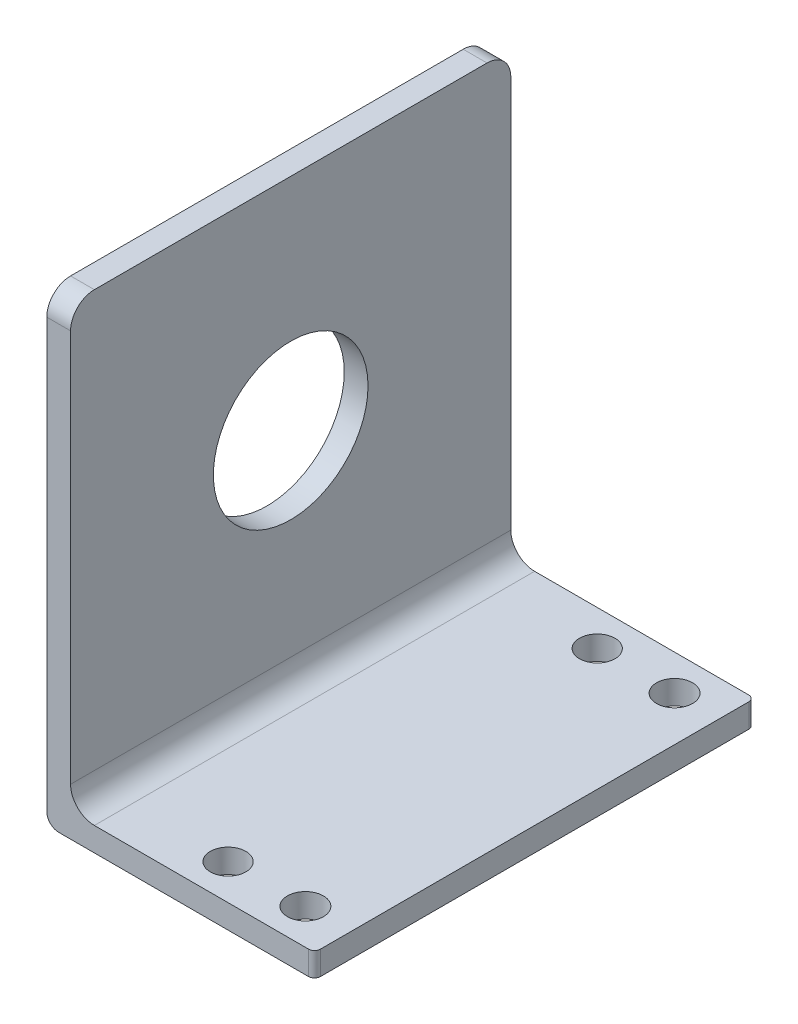
ISO-10303-21;
HEADER;
FILE_DESCRIPTION(('STEP AP214'),'2;1');
FILE_NAME('part.step','',(''),(''),'','','');
FILE_SCHEMA(('AUTOMOTIVE_DESIGN { 1 0 10303 214 1 1 1 1 }'));
ENDSEC;
DATA;
#1=APPLICATION_CONTEXT('core data for automotive mechanical design processes');
#2=APPLICATION_PROTOCOL_DEFINITION('international standard','automotive_design',2000,#1);
#3=PRODUCT_CONTEXT('',#1,'mechanical');
#4=PRODUCT('Part','Part','',(#3));
#5=PRODUCT_RELATED_PRODUCT_CATEGORY('part','',(#4));
#6=PRODUCT_DEFINITION_FORMATION('','',#4);
#7=PRODUCT_DEFINITION_CONTEXT('part definition',#1,'design');
#8=PRODUCT_DEFINITION('design','',#6,#7);
#9=PRODUCT_DEFINITION_SHAPE('','',#8);
#10=(LENGTH_UNIT() NAMED_UNIT(*) SI_UNIT(.MILLI.,.METRE.));
#11=(NAMED_UNIT(*) PLANE_ANGLE_UNIT() SI_UNIT($,.RADIAN.));
#12=(NAMED_UNIT(*) SI_UNIT($,.STERADIAN.) SOLID_ANGLE_UNIT());
#13=UNCERTAINTY_MEASURE_WITH_UNIT(LENGTH_MEASURE(1.E-05),#10,'distance_accuracy_value','');
#14=(GEOMETRIC_REPRESENTATION_CONTEXT(3) GLOBAL_UNCERTAINTY_ASSIGNED_CONTEXT((#13)) GLOBAL_UNIT_ASSIGNED_CONTEXT((#10,
#11,#12)) REPRESENTATION_CONTEXT('',''));
#15=CARTESIAN_POINT('',(0.,0.,0.));
#16=DIRECTION('',(0.,0.,1.));
#17=DIRECTION('',(1.,0.,0.));
#18=AXIS2_PLACEMENT_3D('',#15,#16,#17);
#19=CARTESIAN_POINT('',(20.5,0.,37.));
#20=DIRECTION('',(0.,-1.,0.));
#21=DIRECTION('',(0.,0.,-1.));
#22=AXIS2_PLACEMENT_3D('',#19,#20,#21);
#23=PLANE('',#22);
#24=DIRECTION('',(-1.,0.,0.));
#25=VECTOR('',#24,1.);
#26=CARTESIAN_POINT('',(20.5,0.,0.));
#27=LINE('',#26,#25);
#28=CARTESIAN_POINT('',(20.,0.,0.));
#29=VERTEX_POINT('',#28);
#30=CARTESIAN_POINT('',(2.00000000000001,0.,0.));
#31=VERTEX_POINT('',#30);
#32=EDGE_CURVE('E161',#29,#31,#27,.T.);
#33=ORIENTED_EDGE('',*,*,#32,.T.);
#34=DIRECTION('',(0.,0.,-1.));
#35=VECTOR('',#34,1.);
#36=CARTESIAN_POINT('',(2.,0.,37.));
#37=LINE('',#36,#35);
#38=CARTESIAN_POINT('',(2.00000000000001,0.,37.));
#39=VERTEX_POINT('',#38);
#40=EDGE_CURVE('E61',#31,#39,#37,.F.);
#41=ORIENTED_EDGE('',*,*,#40,.T.);
#42=DIRECTION('',(-1.,0.,0.));
#43=VECTOR('',#42,1.);
#44=CARTESIAN_POINT('',(20.5,0.,37.));
#45=LINE('',#44,#43);
#46=CARTESIAN_POINT('',(20.,0.,37.));
#47=VERTEX_POINT('',#46);
#48=EDGE_CURVE('E173',#47,#39,#45,.T.);
#49=ORIENTED_EDGE('',*,*,#48,.F.);
#50=CARTESIAN_POINT('',(20.,0.,36.5));
#51=DIRECTION('',(0.,-1.,0.));
#52=DIRECTION('',(0.,0.,-1.));
#53=AXIS2_PLACEMENT_3D('',#50,#51,#52);
#54=CIRCLE('',#53,0.5);
#55=CARTESIAN_POINT('',(20.5,0.,36.5));
#56=VERTEX_POINT('',#55);
#57=EDGE_CURVE('E228',#47,#56,#54,.F.);
#58=ORIENTED_EDGE('',*,*,#57,.T.);
#59=DIRECTION('',(0.,0.,-1.));
#60=VECTOR('',#59,1.);
#61=CARTESIAN_POINT('',(20.5,0.,37.));
#62=LINE('',#61,#60);
#63=CARTESIAN_POINT('',(20.5,0.,0.5));
#64=VERTEX_POINT('',#63);
#65=EDGE_CURVE('E157',#56,#64,#62,.T.);
#66=ORIENTED_EDGE('',*,*,#65,.T.);
#67=CARTESIAN_POINT('',(20.,0.,0.5));
#68=DIRECTION('',(0.,-1.,0.));
#69=DIRECTION('',(0.,0.,-1.));
#70=AXIS2_PLACEMENT_3D('',#67,#68,#69);
#71=CIRCLE('',#70,0.5);
#72=EDGE_CURVE('E226',#64,#29,#71,.F.);
#73=ORIENTED_EDGE('',*,*,#72,.T.);
#74=EDGE_LOOP('',(#33,#41,#49,#58,#66,#73));
#75=FACE_BOUND('',#74,.T.);
#76=CARTESIAN_POINT('',(16.75,0.,2.98702889408689));
#77=DIRECTION('',(0.,1.,0.));
#78=DIRECTION('',(0.,0.,1.));
#79=AXIS2_PLACEMENT_3D('',#76,#77,#78);
#80=CIRCLE('',#79,1.51380108054096);
#81=CARTESIAN_POINT('',(16.75,0.,4.50082997462785));
#82=VERTEX_POINT('',#81);
#83=EDGE_CURVE('E192',#82,#82,#80,.T.);
#84=ORIENTED_EDGE('',*,*,#83,.F.);
#85=EDGE_LOOP('',(#84));
#86=FACE_BOUND('',#85,.T.);
#87=CARTESIAN_POINT('',(10.25,0.,2.98702889408689));
#88=DIRECTION('',(0.,1.,0.));
#89=DIRECTION('',(0.,0.,1.));
#90=AXIS2_PLACEMENT_3D('',#87,#88,#89);
#91=CIRCLE('',#90,1.49522613069043);
#92=CARTESIAN_POINT('',(10.25,0.,4.48225502477732));
#93=VERTEX_POINT('',#92);
#94=EDGE_CURVE('E193',#93,#93,#91,.T.);
#95=ORIENTED_EDGE('',*,*,#94,.F.);
#96=EDGE_LOOP('',(#95));
#97=FACE_BOUND('',#96,.T.);
#98=CARTESIAN_POINT('',(16.75,0.,34.0129711059131));
#99=DIRECTION('',(0.,1.,0.));
#100=DIRECTION('',(0.,0.,-1.));
#101=AXIS2_PLACEMENT_3D('',#98,#99,#100);
#102=CIRCLE('',#101,1.51380108054096);
#103=CARTESIAN_POINT('',(16.75,0.,32.4991700253722));
#104=VERTEX_POINT('',#103);
#105=EDGE_CURVE('E199',#104,#104,#102,.T.);
#106=ORIENTED_EDGE('',*,*,#105,.F.);
#107=EDGE_LOOP('',(#106));
#108=FACE_BOUND('',#107,.T.);
#109=CARTESIAN_POINT('',(10.25,0.,34.0129711059131));
#110=DIRECTION('',(0.,1.,0.));
#111=DIRECTION('',(0.,0.,-1.));
#112=AXIS2_PLACEMENT_3D('',#109,#110,#111);
#113=CIRCLE('',#112,1.49522613069043);
#114=CARTESIAN_POINT('',(10.25,0.,32.5177449752227));
#115=VERTEX_POINT('',#114);
#116=EDGE_CURVE('E203',#115,#115,#113,.T.);
#117=ORIENTED_EDGE('',*,*,#116,.F.);
#118=EDGE_LOOP('',(#117));
#119=FACE_BOUND('',#118,.T.);
#120=ADVANCED_FACE('F43',(#75,#86,#97,#108,#119),#23,.F.);
#121=CARTESIAN_POINT('',(0.,0.,37.));
#122=DIRECTION('',(-1.,0.,0.));
#123=DIRECTION('',(0.,0.,1.));
#124=AXIS2_PLACEMENT_3D('',#121,#122,#123);
#125=PLANE('',#124);
#126=CARTESIAN_POINT('',(0.,18.5,18.5));
#127=DIRECTION('',(1.,0.,0.));
#128=DIRECTION('',(0.,0.,-1.));
#129=AXIS2_PLACEMENT_3D('',#126,#127,#128);
#130=CIRCLE('',#129,6.5);
#131=CARTESIAN_POINT('',(0.,18.5,12.));
#132=VERTEX_POINT('',#131);
#133=EDGE_CURVE('E190',#132,#132,#130,.T.);
#134=ORIENTED_EDGE('',*,*,#133,.F.);
#135=EDGE_LOOP('',(#134));
#136=FACE_BOUND('',#135,.T.);
#137=DIRECTION('',(0.,1.,0.));
#138=VECTOR('',#137,1.);
#139=CARTESIAN_POINT('',(0.,0.,37.));
#140=LINE('',#139,#138);
#141=CARTESIAN_POINT('',(0.,2.,37.));
#142=VERTEX_POINT('',#141);
#143=CARTESIAN_POINT('',(0.,35.,37.));
#144=VERTEX_POINT('',#143);
#145=EDGE_CURVE('E142',#142,#144,#140,.T.);
#146=ORIENTED_EDGE('',*,*,#145,.F.);
#147=DIRECTION('',(0.,0.,-1.));
#148=VECTOR('',#147,1.);
#149=CARTESIAN_POINT('',(0.,2.,0.));
#150=LINE('',#149,#148);
#151=CARTESIAN_POINT('',(0.,2.,0.));
#152=VERTEX_POINT('',#151);
#153=EDGE_CURVE('E241',#142,#152,#150,.T.);
#154=ORIENTED_EDGE('',*,*,#153,.T.);
#155=DIRECTION('',(0.,1.,0.));
#156=VECTOR('',#155,1.);
#157=CARTESIAN_POINT('',(0.,0.,0.));
#158=LINE('',#157,#156);
#159=CARTESIAN_POINT('',(0.,35.,0.));
#160=VERTEX_POINT('',#159);
#161=EDGE_CURVE('E164',#152,#160,#158,.T.);
#162=ORIENTED_EDGE('',*,*,#161,.T.);
#163=CARTESIAN_POINT('',(0.,35.,2.));
#164=DIRECTION('',(-1.,0.,0.));
#165=DIRECTION('',(0.,0.,1.));
#166=AXIS2_PLACEMENT_3D('',#163,#164,#165);
#167=CIRCLE('',#166,2.);
#168=CARTESIAN_POINT('',(0.,37.,2.));
#169=VERTEX_POINT('',#168);
#170=EDGE_CURVE('E209',#160,#169,#167,.F.);
#171=ORIENTED_EDGE('',*,*,#170,.T.);
#172=DIRECTION('',(0.,0.,-1.));
#173=VECTOR('',#172,1.);
#174=CARTESIAN_POINT('',(0.,37.,37.));
#175=LINE('',#174,#173);
#176=CARTESIAN_POINT('',(0.,37.,35.));
#177=VERTEX_POINT('',#176);
#178=EDGE_CURVE('E181',#177,#169,#175,.T.);
#179=ORIENTED_EDGE('',*,*,#178,.F.);
#180=CARTESIAN_POINT('',(0.,35.,35.));
#181=DIRECTION('',(-1.,0.,0.));
#182=DIRECTION('',(0.,0.,1.));
#183=AXIS2_PLACEMENT_3D('',#180,#181,#182);
#184=CIRCLE('',#183,2.);
#185=EDGE_CURVE('E207',#177,#144,#184,.F.);
#186=ORIENTED_EDGE('',*,*,#185,.T.);
#187=EDGE_LOOP('',(#146,#154,#162,#171,#179,#186));
#188=FACE_BOUND('',#187,.T.);
#189=ADVANCED_FACE('F250',(#136,#188),#125,.F.);
#190=CARTESIAN_POINT('',(-2.,37.,37.));
#191=DIRECTION('',(0.,1.,0.));
#192=DIRECTION('',(0.,0.,1.));
#193=AXIS2_PLACEMENT_3D('',#190,#191,#192);
#194=PLANE('',#193);
#195=ORIENTED_EDGE('',*,*,#178,.T.);
#196=DIRECTION('',(1.,0.,0.));
#197=VECTOR('',#196,1.);
#198=CARTESIAN_POINT('',(-2.,37.,2.));
#199=LINE('',#198,#197);
#200=CARTESIAN_POINT('',(-2.,37.,2.));
#201=VERTEX_POINT('',#200);
#202=EDGE_CURVE('E211',#169,#201,#199,.F.);
#203=ORIENTED_EDGE('',*,*,#202,.T.);
#204=DIRECTION('',(0.,0.,-1.));
#205=VECTOR('',#204,1.);
#206=CARTESIAN_POINT('',(-2.,37.,37.));
#207=LINE('',#206,#205);
#208=CARTESIAN_POINT('',(-2.,37.,35.));
#209=VERTEX_POINT('',#208);
#210=EDGE_CURVE('E153',#209,#201,#207,.T.);
#211=ORIENTED_EDGE('',*,*,#210,.F.);
#212=DIRECTION('',(1.,0.,0.));
#213=VECTOR('',#212,1.);
#214=CARTESIAN_POINT('',(-2.,37.,35.));
#215=LINE('',#214,#213);
#216=EDGE_CURVE('E212',#209,#177,#215,.T.);
#217=ORIENTED_EDGE('',*,*,#216,.T.);
#218=EDGE_LOOP('',(#195,#203,#211,#217));
#219=FACE_BOUND('',#218,.T.);
#220=ADVANCED_FACE('F256',(#219),#194,.T.);
#221=CARTESIAN_POINT('',(-2.,37.,37.));
#222=DIRECTION('',(1.,0.,0.));
#223=DIRECTION('',(0.,1.,0.));
#224=AXIS2_PLACEMENT_3D('',#221,#222,#223);
#225=PLANE('',#224);
#226=CARTESIAN_POINT('',(-2.,18.5,18.5));
#227=DIRECTION('',(1.,0.,0.));
#228=DIRECTION('',(0.,1.,0.));
#229=AXIS2_PLACEMENT_3D('',#226,#227,#228);
#230=CIRCLE('',#229,6.5);
#231=CARTESIAN_POINT('',(-2.,25.,18.5));
#232=VERTEX_POINT('',#231);
#233=EDGE_CURVE('E168',#232,#232,#230,.T.);
#234=ORIENTED_EDGE('',*,*,#233,.T.);
#235=EDGE_LOOP('',(#234));
#236=FACE_BOUND('',#235,.T.);
#237=ORIENTED_EDGE('',*,*,#210,.T.);
#238=CARTESIAN_POINT('',(-2.,35.,2.));
#239=DIRECTION('',(1.,0.,0.));
#240=DIRECTION('',(0.,1.,0.));
#241=AXIS2_PLACEMENT_3D('',#238,#239,#240);
#242=CIRCLE('',#241,2.);
#243=CARTESIAN_POINT('',(-2.,35.,0.));
#244=VERTEX_POINT('',#243);
#245=EDGE_CURVE('E216',#201,#244,#242,.F.);
#246=ORIENTED_EDGE('',*,*,#245,.T.);
#247=DIRECTION('',(0.,-1.,0.));
#248=VECTOR('',#247,1.);
#249=CARTESIAN_POINT('',(-2.,37.,0.));
#250=LINE('',#249,#248);
#251=CARTESIAN_POINT('',(-2.,-1.,0.));
#252=VERTEX_POINT('',#251);
#253=EDGE_CURVE('E149',#244,#252,#250,.T.);
#254=ORIENTED_EDGE('',*,*,#253,.T.);
#255=DIRECTION('',(0.,0.,-1.));
#256=VECTOR('',#255,1.);
#257=CARTESIAN_POINT('',(-2.,-1.,37.));
#258=LINE('',#257,#256);
#259=CARTESIAN_POINT('',(-2.,-1.,37.));
#260=VERTEX_POINT('',#259);
#261=EDGE_CURVE('E144',#260,#252,#258,.T.);
#262=ORIENTED_EDGE('',*,*,#261,.F.);
#263=DIRECTION('',(0.,-1.,0.));
#264=VECTOR('',#263,1.);
#265=CARTESIAN_POINT('',(-2.,37.,37.));
#266=LINE('',#265,#264);
#267=CARTESIAN_POINT('',(-2.,35.,37.));
#268=VERTEX_POINT('',#267);
#269=EDGE_CURVE('E133',#268,#260,#266,.T.);
#270=ORIENTED_EDGE('',*,*,#269,.F.);
#271=CARTESIAN_POINT('',(-2.,35.,35.));
#272=DIRECTION('',(1.,0.,0.));
#273=DIRECTION('',(0.,1.,0.));
#274=AXIS2_PLACEMENT_3D('',#271,#272,#273);
#275=CIRCLE('',#274,2.);
#276=EDGE_CURVE('E218',#268,#209,#275,.F.);
#277=ORIENTED_EDGE('',*,*,#276,.T.);
#278=EDGE_LOOP('',(#237,#246,#254,#262,#270,#277));
#279=FACE_BOUND('',#278,.T.);
#280=ADVANCED_FACE('F147',(#236,#279),#225,.F.);
#281=CARTESIAN_POINT('',(-0.999999999999995,-1.,37.));
#282=DIRECTION('',(0.,0.,-1.));
#283=DIRECTION('',(-1.,0.,0.));
#284=AXIS2_PLACEMENT_3D('',#281,#282,#283);
#285=CYLINDRICAL_SURFACE('',#284,1.);
#286=CARTESIAN_POINT('',(-0.999999999999995,-1.,0.));
#287=DIRECTION('',(0.,0.,1.));
#288=DIRECTION('',(1.,0.,0.));
#289=AXIS2_PLACEMENT_3D('',#286,#287,#288);
#290=CIRCLE('',#289,1.);
#291=CARTESIAN_POINT('',(-0.999999999999995,-2.,0.));
#292=VERTEX_POINT('',#291);
#293=EDGE_CURVE('E169',#252,#292,#290,.T.);
#294=ORIENTED_EDGE('',*,*,#293,.T.);
#295=DIRECTION('',(0.,0.,-1.));
#296=VECTOR('',#295,1.);
#297=CARTESIAN_POINT('',(-0.999999999999995,-2.,37.));
#298=LINE('',#297,#296);
#299=CARTESIAN_POINT('',(-0.999999999999995,-2.,37.));
#300=VERTEX_POINT('',#299);
#301=EDGE_CURVE('E155',#300,#292,#298,.T.);
#302=ORIENTED_EDGE('',*,*,#301,.F.);
#303=CARTESIAN_POINT('',(-0.999999999999995,-1.,37.));
#304=DIRECTION('',(0.,0.,1.));
#305=DIRECTION('',(1.,0.,0.));
#306=AXIS2_PLACEMENT_3D('',#303,#304,#305);
#307=CIRCLE('',#306,1.);
#308=EDGE_CURVE('E132',#260,#300,#307,.T.);
#309=ORIENTED_EDGE('',*,*,#308,.F.);
#310=ORIENTED_EDGE('',*,*,#261,.T.);
#311=EDGE_LOOP('',(#294,#302,#309,#310));
#312=FACE_BOUND('',#311,.T.);
#313=ADVANCED_FACE('F154',(#312),#285,.T.);
#314=CARTESIAN_POINT('',(-0.999999999999995,-2.,37.));
#315=DIRECTION('',(0.,1.,0.));
#316=DIRECTION('',(0.,0.,1.));
#317=AXIS2_PLACEMENT_3D('',#314,#315,#316);
#318=PLANE('',#317);
#319=CARTESIAN_POINT('',(10.25,-2.,34.0129711059131));
#320=DIRECTION('',(0.,1.,0.));
#321=DIRECTION('',(0.,0.,1.));
#322=AXIS2_PLACEMENT_3D('',#319,#320,#321);
#323=CIRCLE('',#322,1.49522613069043);
#324=CARTESIAN_POINT('',(10.25,-2.,35.5081972366036));
#325=VERTEX_POINT('',#324);
#326=EDGE_CURVE('E197',#325,#325,#323,.T.);
#327=ORIENTED_EDGE('',*,*,#326,.T.);
#328=EDGE_LOOP('',(#327));
#329=FACE_BOUND('',#328,.T.);
#330=CARTESIAN_POINT('',(16.75,-2.,34.0129711059131));
#331=DIRECTION('',(0.,1.,0.));
#332=DIRECTION('',(0.,0.,1.));
#333=AXIS2_PLACEMENT_3D('',#330,#331,#332);
#334=CIRCLE('',#333,1.51380108054096);
#335=CARTESIAN_POINT('',(16.75,-2.,35.5267721864541));
#336=VERTEX_POINT('',#335);
#337=EDGE_CURVE('E198',#336,#336,#334,.T.);
#338=ORIENTED_EDGE('',*,*,#337,.T.);
#339=EDGE_LOOP('',(#338));
#340=FACE_BOUND('',#339,.T.);
#341=CARTESIAN_POINT('',(10.25,-2.,2.98702889408689));
#342=DIRECTION('',(0.,1.,0.));
#343=DIRECTION('',(0.,0.,1.));
#344=AXIS2_PLACEMENT_3D('',#341,#342,#343);
#345=CIRCLE('',#344,1.49522613069043);
#346=CARTESIAN_POINT('',(10.25,-2.,4.48225502477732));
#347=VERTEX_POINT('',#346);
#348=EDGE_CURVE('E195',#347,#347,#345,.T.);
#349=ORIENTED_EDGE('',*,*,#348,.T.);
#350=EDGE_LOOP('',(#349));
#351=FACE_BOUND('',#350,.T.);
#352=CARTESIAN_POINT('',(16.75,-2.,2.98702889408689));
#353=DIRECTION('',(0.,1.,0.));
#354=DIRECTION('',(0.,0.,1.));
#355=AXIS2_PLACEMENT_3D('',#352,#353,#354);
#356=CIRCLE('',#355,1.51380108054096);
#357=CARTESIAN_POINT('',(16.75,-2.,4.50082997462785));
#358=VERTEX_POINT('',#357);
#359=EDGE_CURVE('E189',#358,#358,#356,.T.);
#360=ORIENTED_EDGE('',*,*,#359,.T.);
#361=EDGE_LOOP('',(#360));
#362=FACE_BOUND('',#361,.T.);
#363=CARTESIAN_POINT('',(20.,-2.,36.5));
#364=DIRECTION('',(0.,1.,0.));
#365=DIRECTION('',(0.,0.,1.));
#366=AXIS2_PLACEMENT_3D('',#363,#364,#365);
#367=CIRCLE('',#366,0.5);
#368=CARTESIAN_POINT('',(20.5,-2.,36.5));
#369=VERTEX_POINT('',#368);
#370=CARTESIAN_POINT('',(20.,-2.,37.));
#371=VERTEX_POINT('',#370);
#372=EDGE_CURVE('E231',#369,#371,#367,.F.);
#373=ORIENTED_EDGE('',*,*,#372,.T.);
#374=DIRECTION('',(1.,0.,0.));
#375=VECTOR('',#374,1.);
#376=CARTESIAN_POINT('',(-0.999999999999995,-2.,37.));
#377=LINE('',#376,#375);
#378=EDGE_CURVE('E160',#300,#371,#377,.T.);
#379=ORIENTED_EDGE('',*,*,#378,.F.);
#380=ORIENTED_EDGE('',*,*,#301,.T.);
#381=DIRECTION('',(1.,0.,0.));
#382=VECTOR('',#381,1.);
#383=CARTESIAN_POINT('',(-0.999999999999995,-2.,0.));
#384=LINE('',#383,#382);
#385=CARTESIAN_POINT('',(20.,-2.,0.));
#386=VERTEX_POINT('',#385);
#387=EDGE_CURVE('E171',#292,#386,#384,.T.);
#388=ORIENTED_EDGE('',*,*,#387,.T.);
#389=CARTESIAN_POINT('',(20.,-2.,0.5));
#390=DIRECTION('',(0.,1.,0.));
#391=DIRECTION('',(0.,0.,1.));
#392=AXIS2_PLACEMENT_3D('',#389,#390,#391);
#393=CIRCLE('',#392,0.5);
#394=CARTESIAN_POINT('',(20.5,-2.,0.5));
#395=VERTEX_POINT('',#394);
#396=EDGE_CURVE('E236',#386,#395,#393,.F.);
#397=ORIENTED_EDGE('',*,*,#396,.T.);
#398=DIRECTION('',(0.,0.,-1.));
#399=VECTOR('',#398,1.);
#400=CARTESIAN_POINT('',(20.5,-2.,37.));
#401=LINE('',#400,#399);
#402=EDGE_CURVE('E176',#369,#395,#401,.T.);
#403=ORIENTED_EDGE('',*,*,#402,.F.);
#404=EDGE_LOOP('',(#373,#379,#380,#388,#397,#403));
#405=FACE_BOUND('',#404,.T.);
#406=ADVANCED_FACE('F292',(#329,#340,#351,#362,#405),#318,.F.);
#407=CARTESIAN_POINT('',(20.5,-2.,37.));
#408=DIRECTION('',(-1.,0.,0.));
#409=DIRECTION('',(0.,0.,1.));
#410=AXIS2_PLACEMENT_3D('',#407,#408,#409);
#411=PLANE('',#410);
#412=ORIENTED_EDGE('',*,*,#402,.T.);
#413=DIRECTION('',(0.,1.,0.));
#414=VECTOR('',#413,1.);
#415=CARTESIAN_POINT('',(20.5,-2.,0.5));
#416=LINE('',#415,#414);
#417=EDGE_CURVE('E223',#395,#64,#416,.T.);
#418=ORIENTED_EDGE('',*,*,#417,.T.);
#419=ORIENTED_EDGE('',*,*,#65,.F.);
#420=DIRECTION('',(0.,1.,0.));
#421=VECTOR('',#420,1.);
#422=CARTESIAN_POINT('',(20.5,-2.,36.5));
#423=LINE('',#422,#421);
#424=EDGE_CURVE('E221',#56,#369,#423,.F.);
#425=ORIENTED_EDGE('',*,*,#424,.T.);
#426=EDGE_LOOP('',(#412,#418,#419,#425));
#427=FACE_BOUND('',#426,.T.);
#428=ADVANCED_FACE('F294',(#427),#411,.F.);
#429=CARTESIAN_POINT('',(-0.999999999999995,-1.,37.));
#430=DIRECTION('',(0.,0.,1.));
#431=DIRECTION('',(1.,0.,0.));
#432=AXIS2_PLACEMENT_3D('',#429,#430,#431);
#433=PLANE('',#432);
#434=ORIENTED_EDGE('',*,*,#48,.T.);
#435=CARTESIAN_POINT('',(2.,2.,37.));
#436=DIRECTION('',(0.,0.,1.));
#437=DIRECTION('',(1.,0.,0.));
#438=AXIS2_PLACEMENT_3D('',#435,#436,#437);
#439=CIRCLE('',#438,2.);
#440=EDGE_CURVE('E11',#39,#142,#439,.F.);
#441=ORIENTED_EDGE('',*,*,#440,.T.);
#442=ORIENTED_EDGE('',*,*,#145,.T.);
#443=DIRECTION('',(1.,0.,0.));
#444=VECTOR('',#443,1.);
#445=CARTESIAN_POINT('',(-0.999999999999995,35.,37.));
#446=LINE('',#445,#444);
#447=EDGE_CURVE('E138',#144,#268,#446,.F.);
#448=ORIENTED_EDGE('',*,*,#447,.T.);
#449=ORIENTED_EDGE('',*,*,#269,.T.);
#450=ORIENTED_EDGE('',*,*,#308,.T.);
#451=ORIENTED_EDGE('',*,*,#378,.T.);
#452=DIRECTION('',(0.,1.,0.));
#453=VECTOR('',#452,1.);
#454=CARTESIAN_POINT('',(20.,0.,37.));
#455=LINE('',#454,#453);
#456=EDGE_CURVE('E238',#371,#47,#455,.T.);
#457=ORIENTED_EDGE('',*,*,#456,.T.);
#458=EDGE_LOOP('',(#434,#441,#442,#448,#449,#450,#451,#457));
#459=FACE_BOUND('',#458,.T.);
#460=ADVANCED_FACE('F131',(#459),#433,.T.);
#461=CARTESIAN_POINT('',(-0.999999999999995,-1.,0.));
#462=DIRECTION('',(0.,0.,1.));
#463=DIRECTION('',(1.,0.,0.));
#464=AXIS2_PLACEMENT_3D('',#461,#462,#463);
#465=PLANE('',#464);
#466=DIRECTION('',(0.,1.,0.));
#467=VECTOR('',#466,1.);
#468=CARTESIAN_POINT('',(20.,-1.,0.));
#469=LINE('',#468,#467);
#470=EDGE_CURVE('E229',#29,#386,#469,.F.);
#471=ORIENTED_EDGE('',*,*,#470,.T.);
#472=ORIENTED_EDGE('',*,*,#387,.F.);
#473=ORIENTED_EDGE('',*,*,#293,.F.);
#474=ORIENTED_EDGE('',*,*,#253,.F.);
#475=DIRECTION('',(1.,0.,0.));
#476=VECTOR('',#475,1.);
#477=CARTESIAN_POINT('',(0.,35.,0.));
#478=LINE('',#477,#476);
#479=EDGE_CURVE('E183',#244,#160,#478,.T.);
#480=ORIENTED_EDGE('',*,*,#479,.T.);
#481=ORIENTED_EDGE('',*,*,#161,.F.);
#482=CARTESIAN_POINT('',(2.,2.,0.));
#483=DIRECTION('',(0.,0.,1.));
#484=DIRECTION('',(1.,0.,0.));
#485=AXIS2_PLACEMENT_3D('',#482,#483,#484);
#486=CIRCLE('',#485,2.);
#487=EDGE_CURVE('E51',#152,#31,#486,.T.);
#488=ORIENTED_EDGE('',*,*,#487,.T.);
#489=ORIENTED_EDGE('',*,*,#32,.F.);
#490=EDGE_LOOP('',(#471,#472,#473,#474,#480,#481,#488,#489));
#491=FACE_BOUND('',#490,.T.);
#492=ADVANCED_FACE('F252',(#491),#465,.F.);
#493=CARTESIAN_POINT('',(-10.,18.5,18.5));
#494=DIRECTION('',(1.,0.,0.));
#495=DIRECTION('',(0.,0.,-1.));
#496=AXIS2_PLACEMENT_3D('',#493,#494,#495);
#497=CYLINDRICAL_SURFACE('',#496,6.5);
#498=ORIENTED_EDGE('',*,*,#133,.T.);
#499=EDGE_LOOP('',(#498));
#500=FACE_BOUND('',#499,.T.);
#501=ORIENTED_EDGE('',*,*,#233,.F.);
#502=EDGE_LOOP('',(#501));
#503=FACE_BOUND('',#502,.T.);
#504=ADVANCED_FACE('F305',(#500,#503),#497,.F.);
#505=CARTESIAN_POINT('',(16.75,-10.,2.98702889408689));
#506=DIRECTION('',(0.,1.,0.));
#507=DIRECTION('',(0.,0.,1.));
#508=AXIS2_PLACEMENT_3D('',#505,#506,#507);
#509=CYLINDRICAL_SURFACE('',#508,1.51380108054096);
#510=ORIENTED_EDGE('',*,*,#83,.T.);
#511=EDGE_LOOP('',(#510));
#512=FACE_BOUND('',#511,.T.);
#513=ORIENTED_EDGE('',*,*,#359,.F.);
#514=EDGE_LOOP('',(#513));
#515=FACE_BOUND('',#514,.T.);
#516=ADVANCED_FACE('F310',(#512,#515),#509,.F.);
#517=CARTESIAN_POINT('',(10.25,-10.,2.98702889408689));
#518=DIRECTION('',(0.,1.,0.));
#519=DIRECTION('',(0.,0.,1.));
#520=AXIS2_PLACEMENT_3D('',#517,#518,#519);
#521=CYLINDRICAL_SURFACE('',#520,1.49522613069043);
#522=ORIENTED_EDGE('',*,*,#94,.T.);
#523=EDGE_LOOP('',(#522));
#524=FACE_BOUND('',#523,.T.);
#525=ORIENTED_EDGE('',*,*,#348,.F.);
#526=EDGE_LOOP('',(#525));
#527=FACE_BOUND('',#526,.T.);
#528=ADVANCED_FACE('F311',(#524,#527),#521,.F.);
#529=CARTESIAN_POINT('',(16.75,-10.,34.0129711059131));
#530=DIRECTION('',(0.,1.,0.));
#531=DIRECTION('',(0.,0.,1.));
#532=AXIS2_PLACEMENT_3D('',#529,#530,#531);
#533=CYLINDRICAL_SURFACE('',#532,1.51380108054096);
#534=ORIENTED_EDGE('',*,*,#105,.T.);
#535=EDGE_LOOP('',(#534));
#536=FACE_BOUND('',#535,.T.);
#537=ORIENTED_EDGE('',*,*,#337,.F.);
#538=EDGE_LOOP('',(#537));
#539=FACE_BOUND('',#538,.T.);
#540=ADVANCED_FACE('F314',(#536,#539),#533,.F.);
#541=CARTESIAN_POINT('',(10.25,-10.,34.0129711059131));
#542=DIRECTION('',(0.,1.,0.));
#543=DIRECTION('',(0.,0.,1.));
#544=AXIS2_PLACEMENT_3D('',#541,#542,#543);
#545=CYLINDRICAL_SURFACE('',#544,1.49522613069043);
#546=ORIENTED_EDGE('',*,*,#116,.T.);
#547=EDGE_LOOP('',(#546));
#548=FACE_BOUND('',#547,.T.);
#549=ORIENTED_EDGE('',*,*,#326,.F.);
#550=EDGE_LOOP('',(#549));
#551=FACE_BOUND('',#550,.T.);
#552=ADVANCED_FACE('F274',(#548,#551),#545,.F.);
#553=CARTESIAN_POINT('',(-0.999999999999995,35.,2.));
#554=DIRECTION('',(-1.,0.,0.));
#555=DIRECTION('',(0.,0.,1.));
#556=AXIS2_PLACEMENT_3D('',#553,#554,#555);
#557=CYLINDRICAL_SURFACE('',#556,2.);
#558=ORIENTED_EDGE('',*,*,#245,.F.);
#559=ORIENTED_EDGE('',*,*,#202,.F.);
#560=ORIENTED_EDGE('',*,*,#170,.F.);
#561=ORIENTED_EDGE('',*,*,#479,.F.);
#562=EDGE_LOOP('',(#558,#559,#560,#561));
#563=FACE_BOUND('',#562,.T.);
#564=ADVANCED_FACE('F253',(#563),#557,.T.);
#565=CARTESIAN_POINT('',(-2.,35.,35.));
#566=DIRECTION('',(1.,0.,0.));
#567=DIRECTION('',(0.,0.,-1.));
#568=AXIS2_PLACEMENT_3D('',#565,#566,#567);
#569=CYLINDRICAL_SURFACE('',#568,2.);
#570=ORIENTED_EDGE('',*,*,#276,.F.);
#571=ORIENTED_EDGE('',*,*,#447,.F.);
#572=ORIENTED_EDGE('',*,*,#185,.F.);
#573=ORIENTED_EDGE('',*,*,#216,.F.);
#574=EDGE_LOOP('',(#570,#571,#572,#573));
#575=FACE_BOUND('',#574,.T.);
#576=ADVANCED_FACE('F261',(#575),#569,.T.);
#577=CARTESIAN_POINT('',(20.,-2.,0.5));
#578=DIRECTION('',(0.,1.,0.));
#579=DIRECTION('',(0.,0.,1.));
#580=AXIS2_PLACEMENT_3D('',#577,#578,#579);
#581=CYLINDRICAL_SURFACE('',#580,0.5);
#582=ORIENTED_EDGE('',*,*,#396,.F.);
#583=ORIENTED_EDGE('',*,*,#470,.F.);
#584=ORIENTED_EDGE('',*,*,#72,.F.);
#585=ORIENTED_EDGE('',*,*,#417,.F.);
#586=EDGE_LOOP('',(#582,#583,#584,#585));
#587=FACE_BOUND('',#586,.T.);
#588=ADVANCED_FACE('F262',(#587),#581,.T.);
#589=CARTESIAN_POINT('',(20.,-1.,36.5));
#590=DIRECTION('',(0.,-1.,0.));
#591=DIRECTION('',(0.,0.,-1.));
#592=AXIS2_PLACEMENT_3D('',#589,#590,#591);
#593=CYLINDRICAL_SURFACE('',#592,0.5);
#594=ORIENTED_EDGE('',*,*,#372,.F.);
#595=ORIENTED_EDGE('',*,*,#424,.F.);
#596=ORIENTED_EDGE('',*,*,#57,.F.);
#597=ORIENTED_EDGE('',*,*,#456,.F.);
#598=EDGE_LOOP('',(#594,#595,#596,#597));
#599=FACE_BOUND('',#598,.T.);
#600=ADVANCED_FACE('F272',(#599),#593,.T.);
#601=CARTESIAN_POINT('',(2.,2.,37.));
#602=DIRECTION('',(0.,0.,1.));
#603=DIRECTION('',(1.,0.,0.));
#604=AXIS2_PLACEMENT_3D('',#601,#602,#603);
#605=CYLINDRICAL_SURFACE('',#604,2.);
#606=ORIENTED_EDGE('',*,*,#440,.F.);
#607=ORIENTED_EDGE('',*,*,#40,.F.);
#608=ORIENTED_EDGE('',*,*,#487,.F.);
#609=ORIENTED_EDGE('',*,*,#153,.F.);
#610=EDGE_LOOP('',(#606,#607,#608,#609));
#611=FACE_BOUND('',#610,.T.);
#612=ADVANCED_FACE('F44',(#611),#605,.F.);
#613=CLOSED_SHELL('',(#120,#189,#220,#280,#313,#406,#428,#460,#492,#504,#516,#528,#540,#552,
#564,#576,#588,#600,#612));
#614=MANIFOLD_SOLID_BREP('B2',#613);
#615=ADVANCED_BREP_SHAPE_REPRESENTATION('',(#18,#614),#14);
#616=SHAPE_DEFINITION_REPRESENTATION(#9,#615);
ENDSEC;
END-ISO-10303-21;
